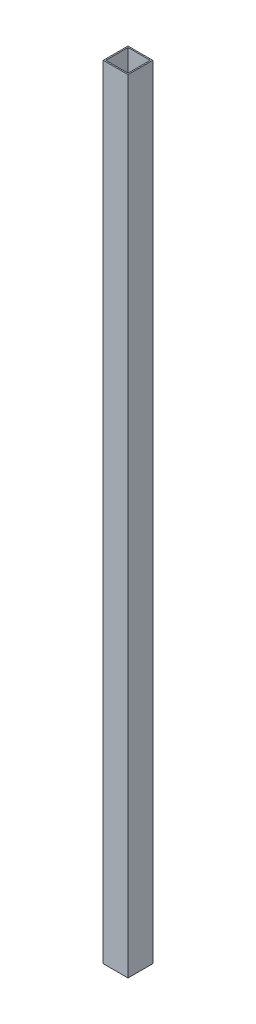
ISO-10303-21;
HEADER;
FILE_DESCRIPTION(('STEP AP214'),'2;1');
FILE_NAME('part.step','',(''),(''),'','','');
FILE_SCHEMA(('AUTOMOTIVE_DESIGN { 1 0 10303 214 1 1 1 1 }'));
ENDSEC;
DATA;
#1=APPLICATION_CONTEXT('core data for automotive mechanical design processes');
#2=APPLICATION_PROTOCOL_DEFINITION('international standard','automotive_design',2000,#1);
#3=PRODUCT_CONTEXT('',#1,'mechanical');
#4=PRODUCT('Part','Part','',(#3));
#5=PRODUCT_RELATED_PRODUCT_CATEGORY('part','',(#4));
#6=PRODUCT_DEFINITION_FORMATION('','',#4);
#7=PRODUCT_DEFINITION_CONTEXT('part definition',#1,'design');
#8=PRODUCT_DEFINITION('design','',#6,#7);
#9=PRODUCT_DEFINITION_SHAPE('','',#8);
#10=(LENGTH_UNIT() NAMED_UNIT(*) SI_UNIT(.MILLI.,.METRE.));
#11=(NAMED_UNIT(*) PLANE_ANGLE_UNIT() SI_UNIT($,.RADIAN.));
#12=(NAMED_UNIT(*) SI_UNIT($,.STERADIAN.) SOLID_ANGLE_UNIT());
#13=UNCERTAINTY_MEASURE_WITH_UNIT(LENGTH_MEASURE(1.E-05),#10,'distance_accuracy_value','');
#14=(GEOMETRIC_REPRESENTATION_CONTEXT(3) GLOBAL_UNCERTAINTY_ASSIGNED_CONTEXT((#13)) GLOBAL_UNIT_ASSIGNED_CONTEXT((#10,
#11,#12)) REPRESENTATION_CONTEXT('',''));
#15=CARTESIAN_POINT('',(0.,0.,0.));
#16=DIRECTION('',(0.,0.,1.));
#17=DIRECTION('',(1.,0.,0.));
#18=AXIS2_PLACEMENT_3D('',#15,#16,#17);
#19=CARTESIAN_POINT('',(0.,802.767,0.));
#20=DIRECTION('',(1.,0.,0.));
#21=DIRECTION('',(0.,0.,-1.));
#22=AXIS2_PLACEMENT_3D('',#19,#20,#21);
#23=PLANE('',#22);
#24=DIRECTION('',(0.,0.,1.));
#25=VECTOR('',#24,1.);
#26=CARTESIAN_POINT('',(0.,0.,0.));
#27=LINE('',#26,#25);
#28=CARTESIAN_POINT('',(0.,0.,-25.4));
#29=VERTEX_POINT('',#28);
#30=CARTESIAN_POINT('',(0.,0.,0.));
#31=VERTEX_POINT('',#30);
#32=EDGE_CURVE('E136',#29,#31,#27,.T.);
#33=ORIENTED_EDGE('',*,*,#32,.T.);
#34=DIRECTION('',(0.,-1.,0.));
#35=VECTOR('',#34,1.);
#36=CARTESIAN_POINT('',(0.,802.767,0.));
#37=LINE('',#36,#35);
#38=CARTESIAN_POINT('',(0.,802.767,0.));
#39=VERTEX_POINT('',#38);
#40=EDGE_CURVE('E11',#39,#31,#37,.T.);
#41=ORIENTED_EDGE('',*,*,#40,.F.);
#42=DIRECTION('',(0.,0.,1.));
#43=VECTOR('',#42,1.);
#44=CARTESIAN_POINT('',(0.,802.767,0.));
#45=LINE('',#44,#43);
#46=CARTESIAN_POINT('',(0.,802.767,-25.4));
#47=VERTEX_POINT('',#46);
#48=EDGE_CURVE('E140',#47,#39,#45,.T.);
#49=ORIENTED_EDGE('',*,*,#48,.F.);
#50=DIRECTION('',(0.,-1.,0.));
#51=VECTOR('',#50,1.);
#52=CARTESIAN_POINT('',(0.,802.767,-25.4));
#53=LINE('',#52,#51);
#54=EDGE_CURVE('E150',#47,#29,#53,.T.);
#55=ORIENTED_EDGE('',*,*,#54,.T.);
#56=EDGE_LOOP('',(#33,#41,#49,#55));
#57=FACE_BOUND('',#56,.T.);
#58=ADVANCED_FACE('F39',(#57),#23,.F.);
#59=CARTESIAN_POINT('',(0.,802.767,0.));
#60=DIRECTION('',(0.,0.,-1.));
#61=DIRECTION('',(-1.,0.,0.));
#62=AXIS2_PLACEMENT_3D('',#59,#60,#61);
#63=PLANE('',#62);
#64=DIRECTION('',(1.,0.,0.));
#65=VECTOR('',#64,1.);
#66=CARTESIAN_POINT('',(0.,0.,0.));
#67=LINE('',#66,#65);
#68=CARTESIAN_POINT('',(25.4,0.,0.));
#69=VERTEX_POINT('',#68);
#70=EDGE_CURVE('E153',#31,#69,#67,.T.);
#71=ORIENTED_EDGE('',*,*,#70,.T.);
#72=DIRECTION('',(0.,-1.,0.));
#73=VECTOR('',#72,1.);
#74=CARTESIAN_POINT('',(25.4,802.767,0.));
#75=LINE('',#74,#73);
#76=CARTESIAN_POINT('',(25.4,802.767,0.));
#77=VERTEX_POINT('',#76);
#78=EDGE_CURVE('E46',#77,#69,#75,.T.);
#79=ORIENTED_EDGE('',*,*,#78,.F.);
#80=DIRECTION('',(1.,0.,0.));
#81=VECTOR('',#80,1.);
#82=CARTESIAN_POINT('',(0.,802.767,0.));
#83=LINE('',#82,#81);
#84=EDGE_CURVE('E143',#39,#77,#83,.T.);
#85=ORIENTED_EDGE('',*,*,#84,.F.);
#86=ORIENTED_EDGE('',*,*,#40,.T.);
#87=EDGE_LOOP('',(#71,#79,#85,#86));
#88=FACE_BOUND('',#87,.T.);
#89=ADVANCED_FACE('F181',(#88),#63,.F.);
#90=CARTESIAN_POINT('',(25.4,802.767,0.));
#91=DIRECTION('',(-1.,0.,0.));
#92=DIRECTION('',(0.,0.,1.));
#93=AXIS2_PLACEMENT_3D('',#90,#91,#92);
#94=PLANE('',#93);
#95=DIRECTION('',(0.,0.,-1.));
#96=VECTOR('',#95,1.);
#97=CARTESIAN_POINT('',(25.4,0.,0.));
#98=LINE('',#97,#96);
#99=CARTESIAN_POINT('',(25.4,0.,-25.4));
#100=VERTEX_POINT('',#99);
#101=EDGE_CURVE('E155',#69,#100,#98,.T.);
#102=ORIENTED_EDGE('',*,*,#101,.T.);
#103=DIRECTION('',(0.,-1.,0.));
#104=VECTOR('',#103,1.);
#105=CARTESIAN_POINT('',(25.4,802.767,-25.4));
#106=LINE('',#105,#104);
#107=CARTESIAN_POINT('',(25.4,802.767,-25.4));
#108=VERTEX_POINT('',#107);
#109=EDGE_CURVE('E160',#108,#100,#106,.T.);
#110=ORIENTED_EDGE('',*,*,#109,.F.);
#111=DIRECTION('',(0.,0.,-1.));
#112=VECTOR('',#111,1.);
#113=CARTESIAN_POINT('',(25.4,802.767,0.));
#114=LINE('',#113,#112);
#115=EDGE_CURVE('E146',#77,#108,#114,.T.);
#116=ORIENTED_EDGE('',*,*,#115,.F.);
#117=ORIENTED_EDGE('',*,*,#78,.T.);
#118=EDGE_LOOP('',(#102,#110,#116,#117));
#119=FACE_BOUND('',#118,.T.);
#120=ADVANCED_FACE('F167',(#119),#94,.F.);
#121=CARTESIAN_POINT('',(0.,802.767,-25.4));
#122=DIRECTION('',(0.,0.,1.));
#123=DIRECTION('',(1.,0.,0.));
#124=AXIS2_PLACEMENT_3D('',#121,#122,#123);
#125=PLANE('',#124);
#126=DIRECTION('',(-1.,0.,0.));
#127=VECTOR('',#126,1.);
#128=CARTESIAN_POINT('',(0.,0.,-25.4));
#129=LINE('',#128,#127);
#130=EDGE_CURVE('E144',#100,#29,#129,.T.);
#131=ORIENTED_EDGE('',*,*,#130,.T.);
#132=ORIENTED_EDGE('',*,*,#54,.F.);
#133=DIRECTION('',(-1.,0.,0.));
#134=VECTOR('',#133,1.);
#135=CARTESIAN_POINT('',(0.,802.767,-25.4));
#136=LINE('',#135,#134);
#137=EDGE_CURVE('E148',#108,#47,#136,.T.);
#138=ORIENTED_EDGE('',*,*,#137,.F.);
#139=ORIENTED_EDGE('',*,*,#109,.T.);
#140=EDGE_LOOP('',(#131,#132,#138,#139));
#141=FACE_BOUND('',#140,.T.);
#142=ADVANCED_FACE('F174',(#141),#125,.F.);
#143=CARTESIAN_POINT('',(0.,802.767,0.));
#144=DIRECTION('',(0.,-1.,0.));
#145=DIRECTION('',(0.,0.,-1.));
#146=AXIS2_PLACEMENT_3D('',#143,#144,#145);
#147=PLANE('',#146);
#148=DIRECTION('',(-1.,0.,0.));
#149=VECTOR('',#148,1.);
#150=CARTESIAN_POINT('',(24.13,802.767,-24.13));
#151=LINE('',#150,#149);
#152=CARTESIAN_POINT('',(24.13,802.767,-24.13));
#153=VERTEX_POINT('',#152);
#154=CARTESIAN_POINT('',(1.27,802.767,-24.13));
#155=VERTEX_POINT('',#154);
#156=EDGE_CURVE('E130',#153,#155,#151,.T.);
#157=ORIENTED_EDGE('',*,*,#156,.F.);
#158=DIRECTION('',(0.,0.,-1.));
#159=VECTOR('',#158,1.);
#160=CARTESIAN_POINT('',(24.13,802.767,-24.13));
#161=LINE('',#160,#159);
#162=CARTESIAN_POINT('',(24.13,802.767,-1.27));
#163=VERTEX_POINT('',#162);
#164=EDGE_CURVE('E53',#163,#153,#161,.T.);
#165=ORIENTED_EDGE('',*,*,#164,.F.);
#166=DIRECTION('',(1.,0.,0.));
#167=VECTOR('',#166,1.);
#168=CARTESIAN_POINT('',(24.13,802.767,-1.27));
#169=LINE('',#168,#167);
#170=CARTESIAN_POINT('',(1.27,802.767,-1.27));
#171=VERTEX_POINT('',#170);
#172=EDGE_CURVE('E121',#171,#163,#169,.T.);
#173=ORIENTED_EDGE('',*,*,#172,.F.);
#174=DIRECTION('',(0.,0.,1.));
#175=VECTOR('',#174,1.);
#176=CARTESIAN_POINT('',(1.27,802.767,-24.13));
#177=LINE('',#176,#175);
#178=EDGE_CURVE('E124',#155,#171,#177,.T.);
#179=ORIENTED_EDGE('',*,*,#178,.F.);
#180=EDGE_LOOP('',(#157,#165,#173,#179));
#181=FACE_BOUND('',#180,.T.);
#182=ORIENTED_EDGE('',*,*,#48,.T.);
#183=ORIENTED_EDGE('',*,*,#84,.T.);
#184=ORIENTED_EDGE('',*,*,#115,.T.);
#185=ORIENTED_EDGE('',*,*,#137,.T.);
#186=EDGE_LOOP('',(#182,#183,#184,#185));
#187=FACE_BOUND('',#186,.T.);
#188=ADVANCED_FACE('F180',(#181,#187),#147,.F.);
#189=CARTESIAN_POINT('',(0.,0.,0.));
#190=DIRECTION('',(0.,-1.,0.));
#191=DIRECTION('',(0.,0.,-1.));
#192=AXIS2_PLACEMENT_3D('',#189,#190,#191);
#193=PLANE('',#192);
#194=DIRECTION('',(0.,0.,-1.));
#195=VECTOR('',#194,1.);
#196=CARTESIAN_POINT('',(24.13,0.,-24.13));
#197=LINE('',#196,#195);
#198=CARTESIAN_POINT('',(24.13,0.,-1.27));
#199=VERTEX_POINT('',#198);
#200=CARTESIAN_POINT('',(24.13,0.,-24.13));
#201=VERTEX_POINT('',#200);
#202=EDGE_CURVE('E105',#199,#201,#197,.T.);
#203=ORIENTED_EDGE('',*,*,#202,.T.);
#204=DIRECTION('',(-1.,0.,0.));
#205=VECTOR('',#204,1.);
#206=CARTESIAN_POINT('',(24.13,0.,-24.13));
#207=LINE('',#206,#205);
#208=CARTESIAN_POINT('',(1.27,0.,-24.13));
#209=VERTEX_POINT('',#208);
#210=EDGE_CURVE('E114',#201,#209,#207,.T.);
#211=ORIENTED_EDGE('',*,*,#210,.T.);
#212=DIRECTION('',(0.,0.,1.));
#213=VECTOR('',#212,1.);
#214=CARTESIAN_POINT('',(1.27,0.,-24.13));
#215=LINE('',#214,#213);
#216=CARTESIAN_POINT('',(1.27,0.,-1.27));
#217=VERTEX_POINT('',#216);
#218=EDGE_CURVE('E61',#209,#217,#215,.T.);
#219=ORIENTED_EDGE('',*,*,#218,.T.);
#220=DIRECTION('',(1.,0.,0.));
#221=VECTOR('',#220,1.);
#222=CARTESIAN_POINT('',(24.13,0.,-1.27));
#223=LINE('',#222,#221);
#224=EDGE_CURVE('E111',#217,#199,#223,.T.);
#225=ORIENTED_EDGE('',*,*,#224,.T.);
#226=EDGE_LOOP('',(#203,#211,#219,#225));
#227=FACE_BOUND('',#226,.T.);
#228=ORIENTED_EDGE('',*,*,#32,.F.);
#229=ORIENTED_EDGE('',*,*,#130,.F.);
#230=ORIENTED_EDGE('',*,*,#101,.F.);
#231=ORIENTED_EDGE('',*,*,#70,.F.);
#232=EDGE_LOOP('',(#228,#229,#230,#231));
#233=FACE_BOUND('',#232,.T.);
#234=ADVANCED_FACE('F118',(#227,#233),#193,.T.);
#235=CARTESIAN_POINT('',(24.13,0.,-24.13));
#236=DIRECTION('',(1.,0.,0.));
#237=DIRECTION('',(0.,0.,-1.));
#238=AXIS2_PLACEMENT_3D('',#235,#236,#237);
#239=PLANE('',#238);
#240=ORIENTED_EDGE('',*,*,#164,.T.);
#241=DIRECTION('',(0.,1.,0.));
#242=VECTOR('',#241,1.);
#243=CARTESIAN_POINT('',(24.13,0.,-24.13));
#244=LINE('',#243,#242);
#245=EDGE_CURVE('E101',#201,#153,#244,.T.);
#246=ORIENTED_EDGE('',*,*,#245,.F.);
#247=ORIENTED_EDGE('',*,*,#202,.F.);
#248=DIRECTION('',(0.,1.,0.));
#249=VECTOR('',#248,1.);
#250=CARTESIAN_POINT('',(24.13,0.,-1.27));
#251=LINE('',#250,#249);
#252=EDGE_CURVE('E134',#199,#163,#251,.T.);
#253=ORIENTED_EDGE('',*,*,#252,.T.);
#254=EDGE_LOOP('',(#240,#246,#247,#253));
#255=FACE_BOUND('',#254,.T.);
#256=ADVANCED_FACE('F103',(#255),#239,.F.);
#257=CARTESIAN_POINT('',(24.13,0.,-1.27));
#258=DIRECTION('',(0.,0.,1.));
#259=DIRECTION('',(1.,0.,0.));
#260=AXIS2_PLACEMENT_3D('',#257,#258,#259);
#261=PLANE('',#260);
#262=ORIENTED_EDGE('',*,*,#172,.T.);
#263=ORIENTED_EDGE('',*,*,#252,.F.);
#264=ORIENTED_EDGE('',*,*,#224,.F.);
#265=DIRECTION('',(0.,1.,0.));
#266=VECTOR('',#265,1.);
#267=CARTESIAN_POINT('',(1.27,0.,-1.27));
#268=LINE('',#267,#266);
#269=EDGE_CURVE('E137',#217,#171,#268,.T.);
#270=ORIENTED_EDGE('',*,*,#269,.T.);
#271=EDGE_LOOP('',(#262,#263,#264,#270));
#272=FACE_BOUND('',#271,.T.);
#273=ADVANCED_FACE('F198',(#272),#261,.F.);
#274=CARTESIAN_POINT('',(1.27,0.,-24.13));
#275=DIRECTION('',(-1.,0.,0.));
#276=DIRECTION('',(0.,0.,1.));
#277=AXIS2_PLACEMENT_3D('',#274,#275,#276);
#278=PLANE('',#277);
#279=ORIENTED_EDGE('',*,*,#178,.T.);
#280=ORIENTED_EDGE('',*,*,#269,.F.);
#281=ORIENTED_EDGE('',*,*,#218,.F.);
#282=DIRECTION('',(0.,1.,0.));
#283=VECTOR('',#282,1.);
#284=CARTESIAN_POINT('',(1.27,0.,-24.13));
#285=LINE('',#284,#283);
#286=EDGE_CURVE('E110',#209,#155,#285,.T.);
#287=ORIENTED_EDGE('',*,*,#286,.T.);
#288=EDGE_LOOP('',(#279,#280,#281,#287));
#289=FACE_BOUND('',#288,.T.);
#290=ADVANCED_FACE('F201',(#289),#278,.F.);
#291=CARTESIAN_POINT('',(24.13,0.,-24.13));
#292=DIRECTION('',(0.,0.,-1.));
#293=DIRECTION('',(-1.,0.,0.));
#294=AXIS2_PLACEMENT_3D('',#291,#292,#293);
#295=PLANE('',#294);
#296=ORIENTED_EDGE('',*,*,#156,.T.);
#297=ORIENTED_EDGE('',*,*,#286,.F.);
#298=ORIENTED_EDGE('',*,*,#210,.F.);
#299=ORIENTED_EDGE('',*,*,#245,.T.);
#300=EDGE_LOOP('',(#296,#297,#298,#299));
#301=FACE_BOUND('',#300,.T.);
#302=ADVANCED_FACE('F115',(#301),#295,.F.);
#303=CLOSED_SHELL('',(#58,#89,#120,#142,#188,#234,#256,#273,#290,#302));
#304=MANIFOLD_SOLID_BREP('B2',#303);
#305=ADVANCED_BREP_SHAPE_REPRESENTATION('',(#18,#304),#14);
#306=SHAPE_DEFINITION_REPRESENTATION(#9,#305);
ENDSEC;
END-ISO-10303-21;
